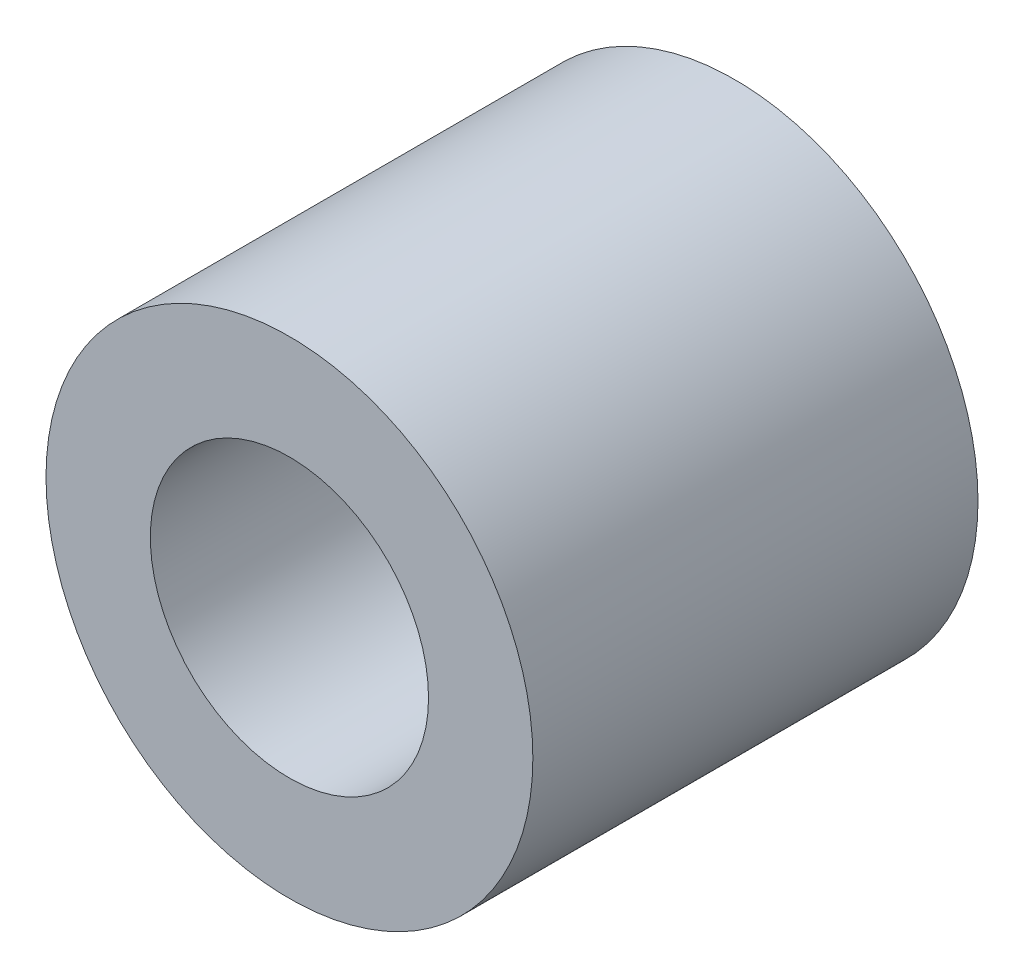
ISO-10303-21;
HEADER;
FILE_DESCRIPTION(('STEP AP214'),'2;1');
FILE_NAME('part.step','',(''),(''),'','','');
FILE_SCHEMA(('AUTOMOTIVE_DESIGN { 1 0 10303 214 1 1 1 1 }'));
ENDSEC;
DATA;
#1=APPLICATION_CONTEXT('core data for automotive mechanical design processes');
#2=APPLICATION_PROTOCOL_DEFINITION('international standard','automotive_design',2000,#1);
#3=PRODUCT_CONTEXT('',#1,'mechanical');
#4=PRODUCT('Part','Part','',(#3));
#5=PRODUCT_RELATED_PRODUCT_CATEGORY('part','',(#4));
#6=PRODUCT_DEFINITION_FORMATION('','',#4);
#7=PRODUCT_DEFINITION_CONTEXT('part definition',#1,'design');
#8=PRODUCT_DEFINITION('design','',#6,#7);
#9=PRODUCT_DEFINITION_SHAPE('','',#8);
#10=(LENGTH_UNIT() NAMED_UNIT(*) SI_UNIT(.MILLI.,.METRE.));
#11=(NAMED_UNIT(*) PLANE_ANGLE_UNIT() SI_UNIT($,.RADIAN.));
#12=(NAMED_UNIT(*) SI_UNIT($,.STERADIAN.) SOLID_ANGLE_UNIT());
#13=UNCERTAINTY_MEASURE_WITH_UNIT(LENGTH_MEASURE(1.E-05),#10,'distance_accuracy_value','');
#14=(GEOMETRIC_REPRESENTATION_CONTEXT(3) GLOBAL_UNCERTAINTY_ASSIGNED_CONTEXT((#13)) GLOBAL_UNIT_ASSIGNED_CONTEXT((#10,
#11,#12)) REPRESENTATION_CONTEXT('',''));
#15=CARTESIAN_POINT('',(0.,0.,0.));
#16=DIRECTION('',(0.,0.,1.));
#17=DIRECTION('',(1.,0.,0.));
#18=AXIS2_PLACEMENT_3D('',#15,#16,#17);
#19=CARTESIAN_POINT('',(0.,0.,6.4));
#20=DIRECTION('',(0.,0.,1.));
#21=DIRECTION('',(1.,0.,0.));
#22=AXIS2_PLACEMENT_3D('',#19,#20,#21);
#23=PLANE('',#22);
#24=CARTESIAN_POINT('',(0.,0.,6.4));
#25=DIRECTION('',(0.,0.,1.));
#26=DIRECTION('',(1.,0.,0.));
#27=AXIS2_PLACEMENT_3D('',#24,#25,#26);
#28=CIRCLE('',#27,3.5);
#29=CARTESIAN_POINT('',(3.5,0.,6.4));
#30=VERTEX_POINT('',#29);
#31=EDGE_CURVE('E10',#30,#30,#28,.T.);
#32=ORIENTED_EDGE('',*,*,#31,.T.);
#33=EDGE_LOOP('',(#32));
#34=FACE_BOUND('',#33,.T.);
#35=CARTESIAN_POINT('',(0.,0.,6.4));
#36=DIRECTION('',(0.,0.,1.));
#37=DIRECTION('',(1.,0.,0.));
#38=AXIS2_PLACEMENT_3D('',#35,#36,#37);
#39=CIRCLE('',#38,2.);
#40=CARTESIAN_POINT('',(2.,0.,6.4));
#41=VERTEX_POINT('',#40);
#42=EDGE_CURVE('E46',#41,#41,#39,.T.);
#43=ORIENTED_EDGE('',*,*,#42,.F.);
#44=EDGE_LOOP('',(#43));
#45=FACE_BOUND('',#44,.T.);
#46=ADVANCED_FACE('F35',(#34,#45),#23,.T.);
#47=CARTESIAN_POINT('',(0.,0.,0.));
#48=DIRECTION('',(0.,0.,1.));
#49=DIRECTION('',(1.,0.,0.));
#50=AXIS2_PLACEMENT_3D('',#47,#48,#49);
#51=PLANE('',#50);
#52=CARTESIAN_POINT('',(0.,0.,0.));
#53=DIRECTION('',(0.,0.,1.));
#54=DIRECTION('',(1.,0.,0.));
#55=AXIS2_PLACEMENT_3D('',#52,#53,#54);
#56=CIRCLE('',#55,3.5);
#57=CARTESIAN_POINT('',(3.5,0.,0.));
#58=VERTEX_POINT('',#57);
#59=EDGE_CURVE('E39',#58,#58,#56,.T.);
#60=ORIENTED_EDGE('',*,*,#59,.F.);
#61=EDGE_LOOP('',(#60));
#62=FACE_BOUND('',#61,.T.);
#63=CARTESIAN_POINT('',(0.,0.,0.));
#64=DIRECTION('',(0.,0.,1.));
#65=DIRECTION('',(1.,0.,0.));
#66=AXIS2_PLACEMENT_3D('',#63,#64,#65);
#67=CIRCLE('',#66,2.);
#68=CARTESIAN_POINT('',(2.,0.,0.));
#69=VERTEX_POINT('',#68);
#70=EDGE_CURVE('E48',#69,#69,#67,.T.);
#71=ORIENTED_EDGE('',*,*,#70,.T.);
#72=EDGE_LOOP('',(#71));
#73=FACE_BOUND('',#72,.T.);
#74=ADVANCED_FACE('F58',(#62,#73),#51,.F.);
#75=CARTESIAN_POINT('',(0.,0.,6.4));
#76=DIRECTION('',(0.,0.,-1.));
#77=DIRECTION('',(-1.,0.,0.));
#78=AXIS2_PLACEMENT_3D('',#75,#76,#77);
#79=CYLINDRICAL_SURFACE('',#78,3.5);
#80=ORIENTED_EDGE('',*,*,#31,.F.);
#81=EDGE_LOOP('',(#80));
#82=FACE_BOUND('',#81,.T.);
#83=ORIENTED_EDGE('',*,*,#59,.T.);
#84=EDGE_LOOP('',(#83));
#85=FACE_BOUND('',#84,.T.);
#86=ADVANCED_FACE('F37',(#82,#85),#79,.T.);
#87=CARTESIAN_POINT('',(0.,0.,6.4));
#88=DIRECTION('',(0.,0.,-1.));
#89=DIRECTION('',(-1.,0.,0.));
#90=AXIS2_PLACEMENT_3D('',#87,#88,#89);
#91=CYLINDRICAL_SURFACE('',#90,2.);
#92=ORIENTED_EDGE('',*,*,#42,.T.);
#93=EDGE_LOOP('',(#92));
#94=FACE_BOUND('',#93,.T.);
#95=ORIENTED_EDGE('',*,*,#70,.F.);
#96=EDGE_LOOP('',(#95));
#97=FACE_BOUND('',#96,.T.);
#98=ADVANCED_FACE('F54',(#94,#97),#91,.F.);
#99=CLOSED_SHELL('',(#46,#74,#86,#98));
#100=MANIFOLD_SOLID_BREP('B2',#99);
#101=ADVANCED_BREP_SHAPE_REPRESENTATION('',(#18,#100),#14);
#102=SHAPE_DEFINITION_REPRESENTATION(#9,#101);
ENDSEC;
END-ISO-10303-21;
